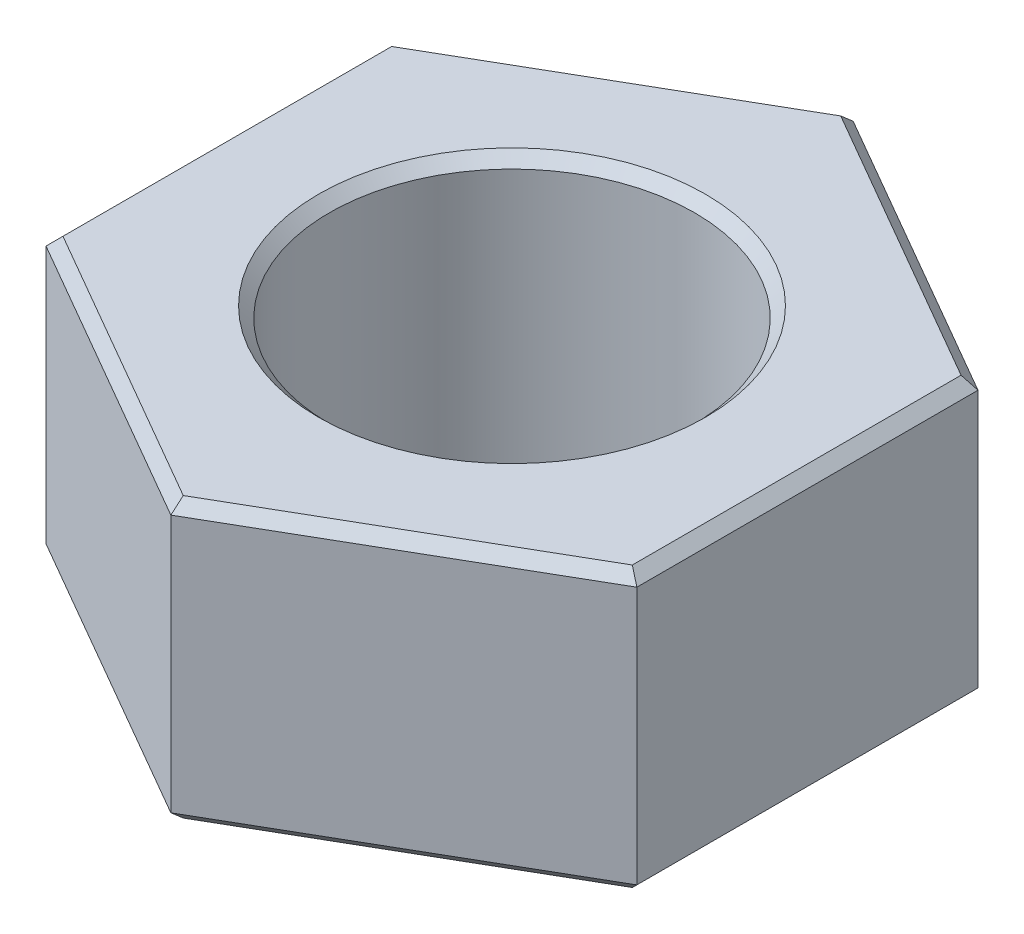
ISO-10303-21;
HEADER;
FILE_DESCRIPTION(('STEP AP214'),'2;1');
FILE_NAME('part.step','',(''),(''),'','','');
FILE_SCHEMA(('AUTOMOTIVE_DESIGN { 1 0 10303 214 1 1 1 1 }'));
ENDSEC;
DATA;
#1=APPLICATION_CONTEXT('core data for automotive mechanical design processes');
#2=APPLICATION_PROTOCOL_DEFINITION('international standard','automotive_design',2000,#1);
#3=PRODUCT_CONTEXT('',#1,'mechanical');
#4=PRODUCT('Part','Part','',(#3));
#5=PRODUCT_RELATED_PRODUCT_CATEGORY('part','',(#4));
#6=PRODUCT_DEFINITION_FORMATION('','',#4);
#7=PRODUCT_DEFINITION_CONTEXT('part definition',#1,'design');
#8=PRODUCT_DEFINITION('design','',#6,#7);
#9=PRODUCT_DEFINITION_SHAPE('','',#8);
#10=(LENGTH_UNIT() NAMED_UNIT(*) SI_UNIT(.MILLI.,.METRE.));
#11=(NAMED_UNIT(*) PLANE_ANGLE_UNIT() SI_UNIT($,.RADIAN.));
#12=(NAMED_UNIT(*) SI_UNIT($,.STERADIAN.) SOLID_ANGLE_UNIT());
#13=UNCERTAINTY_MEASURE_WITH_UNIT(LENGTH_MEASURE(1.E-05),#10,'distance_accuracy_value','');
#14=(GEOMETRIC_REPRESENTATION_CONTEXT(3) GLOBAL_UNCERTAINTY_ASSIGNED_CONTEXT((#13)) GLOBAL_UNIT_ASSIGNED_CONTEXT((#10,
#11,#12)) REPRESENTATION_CONTEXT('',''));
#15=CARTESIAN_POINT('',(0.,0.,0.));
#16=DIRECTION('',(0.,0.,1.));
#17=DIRECTION('',(1.,0.,0.));
#18=AXIS2_PLACEMENT_3D('',#15,#16,#17);
#19=CARTESIAN_POINT('',(0.,26.,0.));
#20=DIRECTION('',(0.,1.,0.));
#21=DIRECTION('',(0.,0.,1.));
#22=AXIS2_PLACEMENT_3D('',#19,#20,#21);
#23=PLANE('',#22);
#24=CARTESIAN_POINT('',(0.,26.,0.));
#25=DIRECTION('',(0.,1.,0.));
#26=DIRECTION('',(0.,0.,1.));
#27=AXIS2_PLACEMENT_3D('',#24,#25,#26);
#28=CIRCLE('',#27,18.);
#29=CARTESIAN_POINT('',(0.,26.,18.));
#30=VERTEX_POINT('',#29);
#31=EDGE_CURVE('E11',#30,#30,#28,.F.);
#32=ORIENTED_EDGE('',*,*,#31,.T.);
#33=EDGE_LOOP('',(#32));
#34=FACE_BOUND('',#33,.T.);
#35=DIRECTION('',(0.866025403784439,0.,-0.5));
#36=VECTOR('',#35,1.);
#37=CARTESIAN_POINT('',(27.,26.,15.0111069989303));
#38=LINE('',#37,#36);
#39=CARTESIAN_POINT('',(0.,26.,30.5995642670502));
#40=VERTEX_POINT('',#39);
#41=CARTESIAN_POINT('',(26.5,26.,15.2997821335251));
#42=VERTEX_POINT('',#41);
#43=EDGE_CURVE('E64',#40,#42,#38,.T.);
#44=ORIENTED_EDGE('',*,*,#43,.T.);
#45=DIRECTION('',(0.,0.,-1.));
#46=VECTOR('',#45,1.);
#47=CARTESIAN_POINT('',(26.5,26.,-15.8771324027147));
#48=LINE('',#47,#46);
#49=CARTESIAN_POINT('',(26.5,26.,-15.2997821335251));
#50=VERTEX_POINT('',#49);
#51=EDGE_CURVE('E56',#42,#50,#48,.T.);
#52=ORIENTED_EDGE('',*,*,#51,.T.);
#53=DIRECTION('',(-0.866025403784439,0.,-0.5));
#54=VECTOR('',#53,1.);
#55=CARTESIAN_POINT('',(-0.499999999999992,26.,-30.888239401645));
#56=LINE('',#55,#54);
#57=CARTESIAN_POINT('',(0.,26.,-30.5995642670502));
#58=VERTEX_POINT('',#57);
#59=EDGE_CURVE('E223',#50,#58,#56,.T.);
#60=ORIENTED_EDGE('',*,*,#59,.T.);
#61=DIRECTION('',(-0.866025403784439,0.,0.5));
#62=VECTOR('',#61,1.);
#63=CARTESIAN_POINT('',(-27.,26.,-15.0111069989303));
#64=LINE('',#63,#62);
#65=CARTESIAN_POINT('',(-26.5,26.,-15.2997821335251));
#66=VERTEX_POINT('',#65);
#67=EDGE_CURVE('E226',#58,#66,#64,.T.);
#68=ORIENTED_EDGE('',*,*,#67,.T.);
#69=DIRECTION('',(0.,0.,1.));
#70=VECTOR('',#69,1.);
#71=CARTESIAN_POINT('',(-26.5,26.,15.8771324027147));
#72=LINE('',#71,#70);
#73=CARTESIAN_POINT('',(-26.5,26.,15.2997821335251));
#74=VERTEX_POINT('',#73);
#75=EDGE_CURVE('E229',#66,#74,#72,.T.);
#76=ORIENTED_EDGE('',*,*,#75,.T.);
#77=DIRECTION('',(0.866025403784439,0.,0.5));
#78=VECTOR('',#77,1.);
#79=CARTESIAN_POINT('',(0.499999999999989,26.,30.888239401645));
#80=LINE('',#79,#78);
#81=EDGE_CURVE('E69',#74,#40,#80,.T.);
#82=ORIENTED_EDGE('',*,*,#81,.T.);
#83=EDGE_LOOP('',(#44,#52,#60,#68,#76,#82));
#84=FACE_BOUND('',#83,.T.);
#85=ADVANCED_FACE('F45',(#34,#84),#23,.T.);
#86=CARTESIAN_POINT('',(0.,0.,0.));
#87=DIRECTION('',(0.,1.,0.));
#88=DIRECTION('',(0.,0.,1.));
#89=AXIS2_PLACEMENT_3D('',#86,#87,#88);
#90=PLANE('',#89);
#91=CARTESIAN_POINT('',(0.,0.,0.));
#92=DIRECTION('',(0.,1.,0.));
#93=DIRECTION('',(0.,0.,1.));
#94=AXIS2_PLACEMENT_3D('',#91,#92,#93);
#95=CIRCLE('',#94,18.);
#96=CARTESIAN_POINT('',(0.,0.,18.));
#97=VERTEX_POINT('',#96);
#98=EDGE_CURVE('E168',#97,#97,#95,.T.);
#99=ORIENTED_EDGE('',*,*,#98,.T.);
#100=EDGE_LOOP('',(#99));
#101=FACE_BOUND('',#100,.T.);
#102=DIRECTION('',(0.,0.,-1.));
#103=VECTOR('',#102,1.);
#104=CARTESIAN_POINT('',(-26.5,0.,0.));
#105=LINE('',#104,#103);
#106=CARTESIAN_POINT('',(-26.5,0.,15.2997821335251));
#107=VERTEX_POINT('',#106);
#108=CARTESIAN_POINT('',(-26.5,0.,-15.2997821335251));
#109=VERTEX_POINT('',#108);
#110=EDGE_CURVE('E166',#107,#109,#105,.T.);
#111=ORIENTED_EDGE('',*,*,#110,.T.);
#112=DIRECTION('',(0.866025403784439,0.,-0.5));
#113=VECTOR('',#112,1.);
#114=CARTESIAN_POINT('',(-13.25,0.,-22.9496732002876));
#115=LINE('',#114,#113);
#116=CARTESIAN_POINT('',(0.,0.,-30.5995642670502));
#117=VERTEX_POINT('',#116);
#118=EDGE_CURVE('E143',#109,#117,#115,.T.);
#119=ORIENTED_EDGE('',*,*,#118,.T.);
#120=DIRECTION('',(0.866025403784439,0.,0.5));
#121=VECTOR('',#120,1.);
#122=CARTESIAN_POINT('',(13.25,0.,-22.9496732002876));
#123=LINE('',#122,#121);
#124=CARTESIAN_POINT('',(26.5,0.,-15.2997821335251));
#125=VERTEX_POINT('',#124);
#126=EDGE_CURVE('E154',#117,#125,#123,.T.);
#127=ORIENTED_EDGE('',*,*,#126,.T.);
#128=DIRECTION('',(0.,0.,1.));
#129=VECTOR('',#128,1.);
#130=CARTESIAN_POINT('',(26.5,0.,0.));
#131=LINE('',#130,#129);
#132=CARTESIAN_POINT('',(26.5,0.,15.2997821335251));
#133=VERTEX_POINT('',#132);
#134=EDGE_CURVE('E161',#125,#133,#131,.T.);
#135=ORIENTED_EDGE('',*,*,#134,.T.);
#136=DIRECTION('',(-0.866025403784439,0.,0.5));
#137=VECTOR('',#136,1.);
#138=CARTESIAN_POINT('',(13.25,0.,22.9496732002876));
#139=LINE('',#138,#137);
#140=CARTESIAN_POINT('',(0.,0.,30.5995642670502));
#141=VERTEX_POINT('',#140);
#142=EDGE_CURVE('E309',#133,#141,#139,.T.);
#143=ORIENTED_EDGE('',*,*,#142,.T.);
#144=DIRECTION('',(-0.866025403784439,0.,-0.5));
#145=VECTOR('',#144,1.);
#146=CARTESIAN_POINT('',(-13.25,0.,22.9496732002876));
#147=LINE('',#146,#145);
#148=EDGE_CURVE('E176',#141,#107,#147,.T.);
#149=ORIENTED_EDGE('',*,*,#148,.T.);
#150=EDGE_LOOP('',(#111,#119,#127,#135,#143,#149));
#151=FACE_BOUND('',#150,.T.);
#152=ADVANCED_FACE('F164',(#101,#151),#90,.F.);
#153=CARTESIAN_POINT('',(27.5,26.,-15.8771324027147));
#154=DIRECTION('',(-0.5,0.,0.866025403784438));
#155=DIRECTION('',(0.866025403784439,0.,0.5));
#156=AXIS2_PLACEMENT_3D('',#153,#154,#155);
#157=PLANE('',#156);
#158=DIRECTION('',(0.,-1.,0.));
#159=VECTOR('',#158,1.);
#160=CARTESIAN_POINT('',(27.5,26.,-15.8771324027147));
#161=LINE('',#160,#159);
#162=CARTESIAN_POINT('',(27.5,25.,-15.8771324027147));
#163=VERTEX_POINT('',#162);
#164=CARTESIAN_POINT('',(27.5,1.,-15.8771324027147));
#165=VERTEX_POINT('',#164);
#166=EDGE_CURVE('E253',#163,#165,#161,.T.);
#167=ORIENTED_EDGE('',*,*,#166,.T.);
#168=DIRECTION('',(-0.866025403784439,0.,-0.5));
#169=VECTOR('',#168,1.);
#170=CARTESIAN_POINT('',(27.5,0.999999999999997,-15.8771324027147));
#171=LINE('',#170,#169);
#172=CARTESIAN_POINT('',(0.,1.,-31.7542648054294));
#173=VERTEX_POINT('',#172);
#174=EDGE_CURVE('E220',#165,#173,#171,.T.);
#175=ORIENTED_EDGE('',*,*,#174,.T.);
#176=DIRECTION('',(0.,-1.,0.));
#177=VECTOR('',#176,1.);
#178=CARTESIAN_POINT('',(0.,26.,-31.7542648054294));
#179=LINE('',#178,#177);
#180=CARTESIAN_POINT('',(0.,25.,-31.7542648054294));
#181=VERTEX_POINT('',#180);
#182=EDGE_CURVE('E162',#181,#173,#179,.T.);
#183=ORIENTED_EDGE('',*,*,#182,.F.);
#184=DIRECTION('',(0.866025403784439,0.,0.5));
#185=VECTOR('',#184,1.);
#186=CARTESIAN_POINT('',(27.5,25.,-15.8771324027147));
#187=LINE('',#186,#185);
#188=EDGE_CURVE('E217',#181,#163,#187,.T.);
#189=ORIENTED_EDGE('',*,*,#188,.T.);
#190=EDGE_LOOP('',(#167,#175,#183,#189));
#191=FACE_BOUND('',#190,.T.);
#192=ADVANCED_FACE('F341',(#191),#157,.F.);
#193=CARTESIAN_POINT('',(0.,26.,-31.7542648054294));
#194=DIRECTION('',(0.5,0.,0.866025403784439));
#195=DIRECTION('',(0.866025403784439,0.,-0.5));
#196=AXIS2_PLACEMENT_3D('',#193,#194,#195);
#197=PLANE('',#196);
#198=ORIENTED_EDGE('',*,*,#182,.T.);
#199=DIRECTION('',(-0.866025403784439,0.,0.5));
#200=VECTOR('',#199,1.);
#201=CARTESIAN_POINT('',(0.,0.99999999999999,-31.7542648054294));
#202=LINE('',#201,#200);
#203=CARTESIAN_POINT('',(-27.5,1.,-15.8771324027147));
#204=VERTEX_POINT('',#203);
#205=EDGE_CURVE('E146',#173,#204,#202,.T.);
#206=ORIENTED_EDGE('',*,*,#205,.T.);
#207=DIRECTION('',(0.,-1.,0.));
#208=VECTOR('',#207,1.);
#209=CARTESIAN_POINT('',(-27.5,26.,-15.8771324027147));
#210=LINE('',#209,#208);
#211=CARTESIAN_POINT('',(-27.5,25.,-15.8771324027147));
#212=VERTEX_POINT('',#211);
#213=EDGE_CURVE('E290',#212,#204,#210,.T.);
#214=ORIENTED_EDGE('',*,*,#213,.F.);
#215=DIRECTION('',(0.866025403784439,0.,-0.5));
#216=VECTOR('',#215,1.);
#217=CARTESIAN_POINT('',(0.,25.,-31.7542648054294));
#218=LINE('',#217,#216);
#219=EDGE_CURVE('E187',#212,#181,#218,.T.);
#220=ORIENTED_EDGE('',*,*,#219,.T.);
#221=EDGE_LOOP('',(#198,#206,#214,#220));
#222=FACE_BOUND('',#221,.T.);
#223=ADVANCED_FACE('F295',(#222),#197,.F.);
#224=CARTESIAN_POINT('',(-27.5,26.,-15.8771324027147));
#225=DIRECTION('',(1.,0.,0.));
#226=DIRECTION('',(0.,0.,-1.));
#227=AXIS2_PLACEMENT_3D('',#224,#225,#226);
#228=PLANE('',#227);
#229=ORIENTED_EDGE('',*,*,#213,.T.);
#230=DIRECTION('',(0.,0.,1.));
#231=VECTOR('',#230,1.);
#232=CARTESIAN_POINT('',(-27.5,0.999999999999994,-15.8771324027147));
#233=LINE('',#232,#231);
#234=CARTESIAN_POINT('',(-27.5,1.,15.8771324027147));
#235=VERTEX_POINT('',#234);
#236=EDGE_CURVE('E195',#204,#235,#233,.T.);
#237=ORIENTED_EDGE('',*,*,#236,.T.);
#238=DIRECTION('',(0.,-1.,0.));
#239=VECTOR('',#238,1.);
#240=CARTESIAN_POINT('',(-27.5,26.,15.8771324027147));
#241=LINE('',#240,#239);
#242=CARTESIAN_POINT('',(-27.5,25.,15.8771324027147));
#243=VERTEX_POINT('',#242);
#244=EDGE_CURVE('E292',#243,#235,#241,.T.);
#245=ORIENTED_EDGE('',*,*,#244,.F.);
#246=DIRECTION('',(0.,0.,-1.));
#247=VECTOR('',#246,1.);
#248=CARTESIAN_POINT('',(-27.5,25.,-15.8771324027147));
#249=LINE('',#248,#247);
#250=EDGE_CURVE('E192',#243,#212,#249,.T.);
#251=ORIENTED_EDGE('',*,*,#250,.T.);
#252=EDGE_LOOP('',(#229,#237,#245,#251));
#253=FACE_BOUND('',#252,.T.);
#254=ADVANCED_FACE('F289',(#253),#228,.F.);
#255=CARTESIAN_POINT('',(-27.5,26.,15.8771324027147));
#256=DIRECTION('',(0.5,0.,-0.866025403784439));
#257=DIRECTION('',(-0.866025403784439,0.,-0.5));
#258=AXIS2_PLACEMENT_3D('',#255,#256,#257);
#259=PLANE('',#258);
#260=ORIENTED_EDGE('',*,*,#244,.T.);
#261=DIRECTION('',(0.866025403784439,0.,0.5));
#262=VECTOR('',#261,1.);
#263=CARTESIAN_POINT('',(-27.5,0.999999999999994,15.8771324027147));
#264=LINE('',#263,#262);
#265=CARTESIAN_POINT('',(0.,1.,31.7542648054294));
#266=VERTEX_POINT('',#265);
#267=EDGE_CURVE('E201',#235,#266,#264,.T.);
#268=ORIENTED_EDGE('',*,*,#267,.T.);
#269=DIRECTION('',(0.,-1.,0.));
#270=VECTOR('',#269,1.);
#271=CARTESIAN_POINT('',(0.,26.,31.7542648054294));
#272=LINE('',#271,#270);
#273=CARTESIAN_POINT('',(0.,25.,31.7542648054294));
#274=VERTEX_POINT('',#273);
#275=EDGE_CURVE('E303',#274,#266,#272,.T.);
#276=ORIENTED_EDGE('',*,*,#275,.F.);
#277=DIRECTION('',(-0.866025403784439,0.,-0.5));
#278=VECTOR('',#277,1.);
#279=CARTESIAN_POINT('',(-27.5,25.,15.8771324027147));
#280=LINE('',#279,#278);
#281=EDGE_CURVE('E198',#274,#243,#280,.T.);
#282=ORIENTED_EDGE('',*,*,#281,.T.);
#283=EDGE_LOOP('',(#260,#268,#276,#282));
#284=FACE_BOUND('',#283,.T.);
#285=ADVANCED_FACE('F324',(#284),#259,.F.);
#286=CARTESIAN_POINT('',(0.,26.,31.7542648054294));
#287=DIRECTION('',(-0.5,0.,-0.866025403784439));
#288=DIRECTION('',(-0.866025403784439,0.,0.5));
#289=AXIS2_PLACEMENT_3D('',#286,#287,#288);
#290=PLANE('',#289);
#291=ORIENTED_EDGE('',*,*,#275,.T.);
#292=DIRECTION('',(0.866025403784439,0.,-0.5));
#293=VECTOR('',#292,1.);
#294=CARTESIAN_POINT('',(0.,0.999999999999994,31.7542648054294));
#295=LINE('',#294,#293);
#296=CARTESIAN_POINT('',(27.5,1.,15.8771324027147));
#297=VERTEX_POINT('',#296);
#298=EDGE_CURVE('E207',#266,#297,#295,.T.);
#299=ORIENTED_EDGE('',*,*,#298,.T.);
#300=DIRECTION('',(0.,-1.,0.));
#301=VECTOR('',#300,1.);
#302=CARTESIAN_POINT('',(27.5,26.,15.8771324027147));
#303=LINE('',#302,#301);
#304=CARTESIAN_POINT('',(27.5,25.,15.8771324027147));
#305=VERTEX_POINT('',#304);
#306=EDGE_CURVE('E330',#305,#297,#303,.T.);
#307=ORIENTED_EDGE('',*,*,#306,.F.);
#308=DIRECTION('',(-0.866025403784439,0.,0.5));
#309=VECTOR('',#308,1.);
#310=CARTESIAN_POINT('',(0.,25.,31.7542648054294));
#311=LINE('',#310,#309);
#312=EDGE_CURVE('E204',#305,#274,#311,.T.);
#313=ORIENTED_EDGE('',*,*,#312,.T.);
#314=EDGE_LOOP('',(#291,#299,#307,#313));
#315=FACE_BOUND('',#314,.T.);
#316=ADVANCED_FACE('F352',(#315),#290,.F.);
#317=CARTESIAN_POINT('',(27.5,26.,15.8771324027147));
#318=DIRECTION('',(-1.,0.,0.));
#319=DIRECTION('',(0.,0.,1.));
#320=AXIS2_PLACEMENT_3D('',#317,#318,#319);
#321=PLANE('',#320);
#322=ORIENTED_EDGE('',*,*,#306,.T.);
#323=DIRECTION('',(0.,0.,-1.));
#324=VECTOR('',#323,1.);
#325=CARTESIAN_POINT('',(27.5,0.999999999999994,15.8771324027147));
#326=LINE('',#325,#324);
#327=EDGE_CURVE('E214',#297,#165,#326,.T.);
#328=ORIENTED_EDGE('',*,*,#327,.T.);
#329=ORIENTED_EDGE('',*,*,#166,.F.);
#330=DIRECTION('',(0.,0.,1.));
#331=VECTOR('',#330,1.);
#332=CARTESIAN_POINT('',(27.5,25.,15.8771324027147));
#333=LINE('',#332,#331);
#334=EDGE_CURVE('E210',#163,#305,#333,.T.);
#335=ORIENTED_EDGE('',*,*,#334,.T.);
#336=EDGE_LOOP('',(#322,#328,#329,#335));
#337=FACE_BOUND('',#336,.T.);
#338=ADVANCED_FACE('F353',(#337),#321,.F.);
#339=CARTESIAN_POINT('',(0.,26.,0.));
#340=DIRECTION('',(0.,-1.,0.));
#341=DIRECTION('',(0.,0.,-1.));
#342=AXIS2_PLACEMENT_3D('',#339,#340,#341);
#343=CYLINDRICAL_SURFACE('',#342,17.);
#344=CARTESIAN_POINT('',(0.,0.999999999999959,0.));
#345=DIRECTION('',(0.,1.,0.));
#346=DIRECTION('',(0.,0.,1.));
#347=AXIS2_PLACEMENT_3D('',#344,#345,#346);
#348=CIRCLE('',#347,17.);
#349=CARTESIAN_POINT('',(0.,0.999999999999959,-17.));
#350=VERTEX_POINT('',#349);
#351=EDGE_CURVE('E183',#350,#350,#348,.F.);
#352=CARTESIAN_POINT('',(0.,25.,0.));
#353=DIRECTION('',(0.,1.,0.));
#354=DIRECTION('',(0.,0.,1.));
#355=AXIS2_PLACEMENT_3D('',#352,#353,#354);
#356=CIRCLE('',#355,17.);
#357=CARTESIAN_POINT('',(0.,25.,-17.));
#358=VERTEX_POINT('',#357);
#359=EDGE_CURVE('E174',#358,#358,#356,.T.);
#360=CARTESIAN_POINT('',(0.,0.999999999999959,-17.));
#361=CARTESIAN_POINT('',(0.,1.24999999999996,-17.));
#362=CARTESIAN_POINT('',(0.,1.49999999999996,-17.));
#363=CARTESIAN_POINT('',(0.,1.99999999999996,-17.));
#364=CARTESIAN_POINT('',(0.,2.24999999999996,-17.));
#365=CARTESIAN_POINT('',(0.,2.74999999999996,-17.));
#366=CARTESIAN_POINT('',(0.,2.99999999999996,-17.));
#367=CARTESIAN_POINT('',(0.,3.49999999999996,-17.));
#368=CARTESIAN_POINT('',(0.,3.74999999999996,-17.));
#369=CARTESIAN_POINT('',(0.,4.24999999999996,-17.));
#370=CARTESIAN_POINT('',(0.,4.49999999999996,-17.));
#371=CARTESIAN_POINT('',(0.,4.99999999999996,-17.));
#372=CARTESIAN_POINT('',(0.,5.24999999999996,-17.));
#373=CARTESIAN_POINT('',(0.,5.74999999999996,-17.));
#374=CARTESIAN_POINT('',(0.,5.99999999999996,-17.));
#375=CARTESIAN_POINT('',(0.,6.49999999999996,-17.));
#376=CARTESIAN_POINT('',(0.,6.74999999999996,-17.));
#377=CARTESIAN_POINT('',(0.,7.24999999999996,-17.));
#378=CARTESIAN_POINT('',(0.,7.49999999999997,-17.));
#379=CARTESIAN_POINT('',(0.,7.99999999999997,-17.));
#380=CARTESIAN_POINT('',(0.,8.24999999999997,-17.));
#381=CARTESIAN_POINT('',(0.,8.74999999999997,-17.));
#382=CARTESIAN_POINT('',(0.,8.99999999999997,-17.));
#383=CARTESIAN_POINT('',(0.,9.49999999999997,-17.));
#384=CARTESIAN_POINT('',(0.,9.74999999999997,-17.));
#385=CARTESIAN_POINT('',(0.,10.25,-17.));
#386=CARTESIAN_POINT('',(0.,10.5,-17.));
#387=CARTESIAN_POINT('',(0.,11.,-17.));
#388=CARTESIAN_POINT('',(0.,11.25,-17.));
#389=CARTESIAN_POINT('',(0.,11.75,-17.));
#390=CARTESIAN_POINT('',(0.,12.,-17.));
#391=CARTESIAN_POINT('',(0.,12.5,-17.));
#392=CARTESIAN_POINT('',(0.,12.75,-17.));
#393=CARTESIAN_POINT('',(0.,13.25,-17.));
#394=CARTESIAN_POINT('',(0.,13.5,-17.));
#395=CARTESIAN_POINT('',(0.,14.,-17.));
#396=CARTESIAN_POINT('',(0.,14.25,-17.));
#397=CARTESIAN_POINT('',(0.,14.75,-17.));
#398=CARTESIAN_POINT('',(0.,15.,-17.));
#399=CARTESIAN_POINT('',(0.,15.5,-17.));
#400=CARTESIAN_POINT('',(0.,15.75,-17.));
#401=CARTESIAN_POINT('',(0.,16.25,-17.));
#402=CARTESIAN_POINT('',(0.,16.5,-17.));
#403=CARTESIAN_POINT('',(0.,17.,-17.));
#404=CARTESIAN_POINT('',(0.,17.25,-17.));
#405=CARTESIAN_POINT('',(0.,17.75,-17.));
#406=CARTESIAN_POINT('',(0.,18.,-17.));
#407=CARTESIAN_POINT('',(0.,18.5,-17.));
#408=CARTESIAN_POINT('',(0.,18.75,-17.));
#409=CARTESIAN_POINT('',(0.,19.25,-17.));
#410=CARTESIAN_POINT('',(0.,19.5,-17.));
#411=CARTESIAN_POINT('',(0.,20.,-17.));
#412=CARTESIAN_POINT('',(0.,20.25,-17.));
#413=CARTESIAN_POINT('',(0.,20.75,-17.));
#414=CARTESIAN_POINT('',(0.,21.,-17.));
#415=CARTESIAN_POINT('',(0.,21.5,-17.));
#416=CARTESIAN_POINT('',(0.,21.75,-17.));
#417=CARTESIAN_POINT('',(0.,22.25,-17.));
#418=CARTESIAN_POINT('',(0.,22.5,-17.));
#419=CARTESIAN_POINT('',(0.,23.,-17.));
#420=CARTESIAN_POINT('',(0.,23.25,-17.));
#421=CARTESIAN_POINT('',(0.,23.75,-17.));
#422=CARTESIAN_POINT('',(0.,24.,-17.));
#423=CARTESIAN_POINT('',(0.,24.5,-17.));
#424=CARTESIAN_POINT('',(0.,24.75,-17.));
#425=CARTESIAN_POINT('',(0.,25.,-17.));
#426=B_SPLINE_CURVE_WITH_KNOTS('',3,(#360,#361,#362,#363,#364,#365,#366,#367,#368,#369,#370,
#371,#372,#373,#374,#375,#376,#377,#378,#379,#380,#381,#382,#383,#384,#385,#386,#387,#388,#389,
#390,#391,#392,#393,#394,#395,#396,#397,#398,#399,#400,#401,#402,#403,#404,#405,#406,#407,#408,
#409,#410,#411,#412,#413,#414,#415,#416,#417,#418,#419,#420,#421,#422,#423,#424,#425),
.UNSPECIFIED.,.F.,.F.,(4,2,2,2,2,2,2,2,2,2,2,2,2,2,2,2,2,2,2,2,2,2,2,2,2,2,2,2,2,2,2,2,4),(0.,
0.750000000000001,1.5,2.25,3.,3.75,4.5,5.25,6.00000000000001,6.75000000000001,7.50000000000001,
8.25000000000001,9.00000000000001,9.75000000000001,10.5,11.25,12.,12.75,13.5,14.25,15.,15.75,
16.5,17.25,18.,18.75,19.5,20.25,21.,21.75,22.5,23.25,24.),.UNSPECIFIED.);
#427=EDGE_CURVE('BSEAM372',#350,#358,#426,.T.);
#428=ORIENTED_EDGE('',*,*,#351,.T.);
#429=ORIENTED_EDGE('',*,*,#359,.T.);
#430=ORIENTED_EDGE('',*,*,#427,.T.);
#431=ORIENTED_EDGE('',*,*,#427,.F.);
#432=EDGE_LOOP('',(#428,#430,#429,#431));
#433=FACE_BOUND('',#432,.T.);
#434=ADVANCED_FACE('F372',(#433),#343,.F.);
#435=CARTESIAN_POINT('',(0.,0.,0.));
#436=DIRECTION('',(0.,-1.,0.));
#437=DIRECTION('',(0.,0.,-1.));
#438=AXIS2_PLACEMENT_3D('',#435,#436,#437);
#439=CONICAL_SURFACE('',#438,18.,0.785398163397453);
#440=ORIENTED_EDGE('',*,*,#351,.F.);
#441=EDGE_LOOP('',(#440));
#442=FACE_BOUND('',#441,.T.);
#443=ORIENTED_EDGE('',*,*,#98,.F.);
#444=EDGE_LOOP('',(#443));
#445=FACE_BOUND('',#444,.T.);
#446=ADVANCED_FACE('F387',(#442,#445),#439,.F.);
#447=CARTESIAN_POINT('',(0.,0.999999999999994,31.7542648054294));
#448=DIRECTION('',(-0.353553390593271,0.707106781186553,-0.61237243569579));
#449=DIRECTION('',(0.866025403784439,0.,-0.5));
#450=AXIS2_PLACEMENT_3D('',#447,#448,#449);
#451=PLANE('',#450);
#452=DIRECTION('',(0.,-0.654653670707973,-0.755928946018458));
#453=VECTOR('',#452,1.);
#454=CARTESIAN_POINT('',(0.,0.999999999999994,31.7542648054294));
#455=LINE('',#454,#453);
#456=EDGE_CURVE('E245',#141,#266,#455,.F.);
#457=ORIENTED_EDGE('',*,*,#456,.F.);
#458=ORIENTED_EDGE('',*,*,#142,.F.);
#459=DIRECTION('',(-0.65465367070798,-0.654653670707972,-0.37796447300923));
#460=VECTOR('',#459,1.);
#461=CARTESIAN_POINT('',(27.5,0.999999999999993,15.8771324027147));
#462=LINE('',#461,#460);
#463=EDGE_CURVE('E249',#297,#133,#462,.T.);
#464=ORIENTED_EDGE('',*,*,#463,.F.);
#465=ORIENTED_EDGE('',*,*,#298,.F.);
#466=EDGE_LOOP('',(#457,#458,#464,#465));
#467=FACE_BOUND('',#466,.T.);
#468=ADVANCED_FACE('F350',(#467),#451,.F.);
#469=CARTESIAN_POINT('',(27.5,0.999999999999994,15.8771324027147));
#470=DIRECTION('',(-0.707106781186543,0.707106781186552,0.));
#471=DIRECTION('',(0.,0.,-1.));
#472=AXIS2_PLACEMENT_3D('',#469,#470,#471);
#473=PLANE('',#472);
#474=ORIENTED_EDGE('',*,*,#463,.T.);
#475=ORIENTED_EDGE('',*,*,#134,.F.);
#476=DIRECTION('',(-0.654653670707982,-0.654653670707974,0.377964473009226));
#477=VECTOR('',#476,1.);
#478=CARTESIAN_POINT('',(27.5,0.999999999999994,-15.8771324027147));
#479=LINE('',#478,#477);
#480=EDGE_CURVE('E157',#165,#125,#479,.T.);
#481=ORIENTED_EDGE('',*,*,#480,.F.);
#482=ORIENTED_EDGE('',*,*,#327,.F.);
#483=EDGE_LOOP('',(#474,#475,#481,#482));
#484=FACE_BOUND('',#483,.T.);
#485=ADVANCED_FACE('F347',(#484),#473,.F.);
#486=CARTESIAN_POINT('',(-27.5,0.999999999999994,15.8771324027147));
#487=DIRECTION('',(0.353553390593272,0.707106781186551,-0.612372435695791));
#488=DIRECTION('',(0.866025403784439,0.,0.5));
#489=AXIS2_PLACEMENT_3D('',#486,#487,#488);
#490=PLANE('',#489);
#491=ORIENTED_EDGE('',*,*,#456,.T.);
#492=ORIENTED_EDGE('',*,*,#267,.F.);
#493=DIRECTION('',(0.65465367070798,-0.654653670707973,-0.377964473009229));
#494=VECTOR('',#493,1.);
#495=CARTESIAN_POINT('',(-27.5,0.999999999999994,15.8771324027147));
#496=LINE('',#495,#494);
#497=EDGE_CURVE('E150',#107,#235,#496,.F.);
#498=ORIENTED_EDGE('',*,*,#497,.F.);
#499=ORIENTED_EDGE('',*,*,#148,.F.);
#500=EDGE_LOOP('',(#491,#492,#498,#499));
#501=FACE_BOUND('',#500,.T.);
#502=ADVANCED_FACE('F319',(#501),#490,.F.);
#503=CARTESIAN_POINT('',(27.5,0.999999999999994,-15.8771324027147));
#504=DIRECTION('',(-0.353553390593273,0.70710678118655,0.612372435695792));
#505=DIRECTION('',(-0.866025403784439,0.,-0.5));
#506=AXIS2_PLACEMENT_3D('',#503,#504,#505);
#507=PLANE('',#506);
#508=ORIENTED_EDGE('',*,*,#480,.T.);
#509=ORIENTED_EDGE('',*,*,#126,.F.);
#510=DIRECTION('',(0.,0.654653670707974,-0.755928946018458));
#511=VECTOR('',#510,1.);
#512=CARTESIAN_POINT('',(0.,-6.85714285714292,-22.6816177181637));
#513=LINE('',#512,#511);
#514=EDGE_CURVE('E139',#173,#117,#513,.F.);
#515=ORIENTED_EDGE('',*,*,#514,.F.);
#516=ORIENTED_EDGE('',*,*,#174,.F.);
#517=EDGE_LOOP('',(#508,#509,#515,#516));
#518=FACE_BOUND('',#517,.T.);
#519=ADVANCED_FACE('F155',(#518),#507,.F.);
#520=CARTESIAN_POINT('',(-27.5,0.999999999999994,-15.8771324027147));
#521=DIRECTION('',(0.707106781186544,0.707106781186551,0.));
#522=DIRECTION('',(0.,0.,1.));
#523=AXIS2_PLACEMENT_3D('',#520,#521,#522);
#524=PLANE('',#523);
#525=ORIENTED_EDGE('',*,*,#497,.T.);
#526=ORIENTED_EDGE('',*,*,#236,.F.);
#527=DIRECTION('',(0.65465367070798,-0.654653670707973,0.377964473009231));
#528=VECTOR('',#527,1.);
#529=CARTESIAN_POINT('',(-27.5,0.999999999999993,-15.8771324027147));
#530=LINE('',#529,#528);
#531=EDGE_CURVE('E151',#109,#204,#530,.F.);
#532=ORIENTED_EDGE('',*,*,#531,.F.);
#533=ORIENTED_EDGE('',*,*,#110,.F.);
#534=EDGE_LOOP('',(#525,#526,#532,#533));
#535=FACE_BOUND('',#534,.T.);
#536=ADVANCED_FACE('F322',(#535),#524,.F.);
#537=CARTESIAN_POINT('',(0.,0.999999999999994,-31.7542648054294));
#538=DIRECTION('',(0.353553390593271,0.707106781186552,0.612372435695791));
#539=DIRECTION('',(-0.866025403784439,0.,0.5));
#540=AXIS2_PLACEMENT_3D('',#537,#538,#539);
#541=PLANE('',#540);
#542=ORIENTED_EDGE('',*,*,#514,.T.);
#543=ORIENTED_EDGE('',*,*,#118,.F.);
#544=ORIENTED_EDGE('',*,*,#531,.T.);
#545=ORIENTED_EDGE('',*,*,#205,.F.);
#546=EDGE_LOOP('',(#542,#543,#544,#545));
#547=FACE_BOUND('',#546,.T.);
#548=ADVANCED_FACE('F141',(#547),#541,.F.);
#549=CARTESIAN_POINT('',(0.,25.,0.));
#550=DIRECTION('',(0.,1.,0.));
#551=DIRECTION('',(0.,0.,1.));
#552=AXIS2_PLACEMENT_3D('',#549,#550,#551);
#553=CONICAL_SURFACE('',#552,17.,0.78539816339745);
#554=ORIENTED_EDGE('',*,*,#31,.F.);
#555=EDGE_LOOP('',(#554));
#556=FACE_BOUND('',#555,.T.);
#557=ORIENTED_EDGE('',*,*,#359,.F.);
#558=EDGE_LOOP('',(#557));
#559=FACE_BOUND('',#558,.T.);
#560=ADVANCED_FACE('F401',(#556,#559),#553,.F.);
#561=CARTESIAN_POINT('',(-26.5,26.,0.));
#562=DIRECTION('',(-0.707106781186551,0.707106781186544,0.));
#563=DIRECTION('',(0.,0.,-1.));
#564=AXIS2_PLACEMENT_3D('',#561,#562,#563);
#565=PLANE('',#564);
#566=DIRECTION('',(0.654653670707974,0.65465367070798,0.377964473009228));
#567=VECTOR('',#566,1.);
#568=CARTESIAN_POINT('',(-22.7142857142858,29.7857142857143,-13.114098971593));
#569=LINE('',#568,#567);
#570=EDGE_CURVE('E267',#212,#66,#569,.T.);
#571=ORIENTED_EDGE('',*,*,#570,.F.);
#572=ORIENTED_EDGE('',*,*,#250,.F.);
#573=DIRECTION('',(0.654653670707975,0.654653670707981,-0.377964473009224));
#574=VECTOR('',#573,1.);
#575=CARTESIAN_POINT('',(-22.7142857142858,29.7857142857143,13.114098971593));
#576=LINE('',#575,#574);
#577=EDGE_CURVE('E50',#74,#243,#576,.F.);
#578=ORIENTED_EDGE('',*,*,#577,.F.);
#579=ORIENTED_EDGE('',*,*,#75,.F.);
#580=EDGE_LOOP('',(#571,#572,#578,#579));
#581=FACE_BOUND('',#580,.T.);
#582=ADVANCED_FACE('F48',(#581),#565,.T.);
#583=CARTESIAN_POINT('',(-13.25,26.,22.9496732002876));
#584=DIRECTION('',(-0.353553390593276,0.707106781186543,0.612372435695798));
#585=DIRECTION('',(-0.866025403784439,0.,-0.5));
#586=AXIS2_PLACEMENT_3D('',#583,#584,#585);
#587=PLANE('',#586);
#588=ORIENTED_EDGE('',*,*,#577,.T.);
#589=ORIENTED_EDGE('',*,*,#281,.F.);
#590=DIRECTION('',(0.,0.65465367070798,-0.755928946018452));
#591=VECTOR('',#590,1.);
#592=CARTESIAN_POINT('',(0.,29.7857142857143,26.2281979431859));
#593=LINE('',#592,#591);
#594=EDGE_CURVE('E264',#40,#274,#593,.F.);
#595=ORIENTED_EDGE('',*,*,#594,.F.);
#596=ORIENTED_EDGE('',*,*,#81,.F.);
#597=EDGE_LOOP('',(#588,#589,#595,#596));
#598=FACE_BOUND('',#597,.T.);
#599=ADVANCED_FACE('F281',(#598),#587,.T.);
#600=CARTESIAN_POINT('',(-13.25,26.,-22.9496732002876));
#601=DIRECTION('',(-0.353553390593275,0.707106781186545,-0.612372435695797));
#602=DIRECTION('',(0.866025403784439,0.,-0.5));
#603=AXIS2_PLACEMENT_3D('',#600,#601,#602);
#604=PLANE('',#603);
#605=ORIENTED_EDGE('',*,*,#570,.T.);
#606=ORIENTED_EDGE('',*,*,#67,.F.);
#607=DIRECTION('',(0.,0.654653670707981,0.755928946018451));
#608=VECTOR('',#607,1.);
#609=CARTESIAN_POINT('',(0.,29.7857142857143,-26.2281979431859));
#610=LINE('',#609,#608);
#611=EDGE_CURVE('E260',#181,#58,#610,.T.);
#612=ORIENTED_EDGE('',*,*,#611,.F.);
#613=ORIENTED_EDGE('',*,*,#219,.F.);
#614=EDGE_LOOP('',(#605,#606,#612,#613));
#615=FACE_BOUND('',#614,.T.);
#616=ADVANCED_FACE('F447',(#615),#604,.T.);
#617=CARTESIAN_POINT('',(13.25,26.,22.9496732002876));
#618=DIRECTION('',(0.353553390593274,0.707106781186546,0.612372435695796));
#619=DIRECTION('',(-0.866025403784439,0.,0.5));
#620=AXIS2_PLACEMENT_3D('',#617,#618,#619);
#621=PLANE('',#620);
#622=ORIENTED_EDGE('',*,*,#594,.T.);
#623=ORIENTED_EDGE('',*,*,#312,.F.);
#624=DIRECTION('',(-0.654653670707974,0.654653670707979,-0.377964473009229));
#625=VECTOR('',#624,1.);
#626=CARTESIAN_POINT('',(22.7142857142858,29.7857142857143,13.114098971593));
#627=LINE('',#626,#625);
#628=EDGE_CURVE('E257',#42,#305,#627,.F.);
#629=ORIENTED_EDGE('',*,*,#628,.F.);
#630=ORIENTED_EDGE('',*,*,#43,.F.);
#631=EDGE_LOOP('',(#622,#623,#629,#630));
#632=FACE_BOUND('',#631,.T.);
#633=ADVANCED_FACE('F441',(#632),#621,.T.);
#634=CARTESIAN_POINT('',(13.25,26.,-22.9496732002876));
#635=DIRECTION('',(0.353553390593276,0.707106781186543,-0.612372435695798));
#636=DIRECTION('',(0.866025403784439,0.,0.5));
#637=AXIS2_PLACEMENT_3D('',#634,#635,#636);
#638=PLANE('',#637);
#639=ORIENTED_EDGE('',*,*,#611,.T.);
#640=ORIENTED_EDGE('',*,*,#59,.F.);
#641=DIRECTION('',(0.654653670707975,-0.654653670707981,-0.377964473009224));
#642=VECTOR('',#641,1.);
#643=CARTESIAN_POINT('',(22.7142857142857,29.7857142857143,-13.114098971593));
#644=LINE('',#643,#642);
#645=EDGE_CURVE('E254',#163,#50,#644,.F.);
#646=ORIENTED_EDGE('',*,*,#645,.F.);
#647=ORIENTED_EDGE('',*,*,#188,.F.);
#648=EDGE_LOOP('',(#639,#640,#646,#647));
#649=FACE_BOUND('',#648,.T.);
#650=ADVANCED_FACE('F361',(#649),#638,.T.);
#651=CARTESIAN_POINT('',(26.5,26.,0.));
#652=DIRECTION('',(0.707106781186551,0.707106781186544,0.));
#653=DIRECTION('',(0.,0.,1.));
#654=AXIS2_PLACEMENT_3D('',#651,#652,#653);
#655=PLANE('',#654);
#656=ORIENTED_EDGE('',*,*,#628,.T.);
#657=ORIENTED_EDGE('',*,*,#334,.F.);
#658=ORIENTED_EDGE('',*,*,#645,.T.);
#659=ORIENTED_EDGE('',*,*,#51,.F.);
#660=EDGE_LOOP('',(#656,#657,#658,#659));
#661=FACE_BOUND('',#660,.T.);
#662=ADVANCED_FACE('F356',(#661),#655,.T.);
#663=CLOSED_SHELL('',(#85,#152,#192,#223,#254,#285,#316,#338,#434,#446,#468,#485,#502,#519,#536,
#548,#560,#582,#599,#616,#633,#650,#662));
#664=MANIFOLD_SOLID_BREP('B2',#663);
#665=ADVANCED_BREP_SHAPE_REPRESENTATION('',(#18,#664),#14);
#666=SHAPE_DEFINITION_REPRESENTATION(#9,#665);
ENDSEC;
END-ISO-10303-21;
